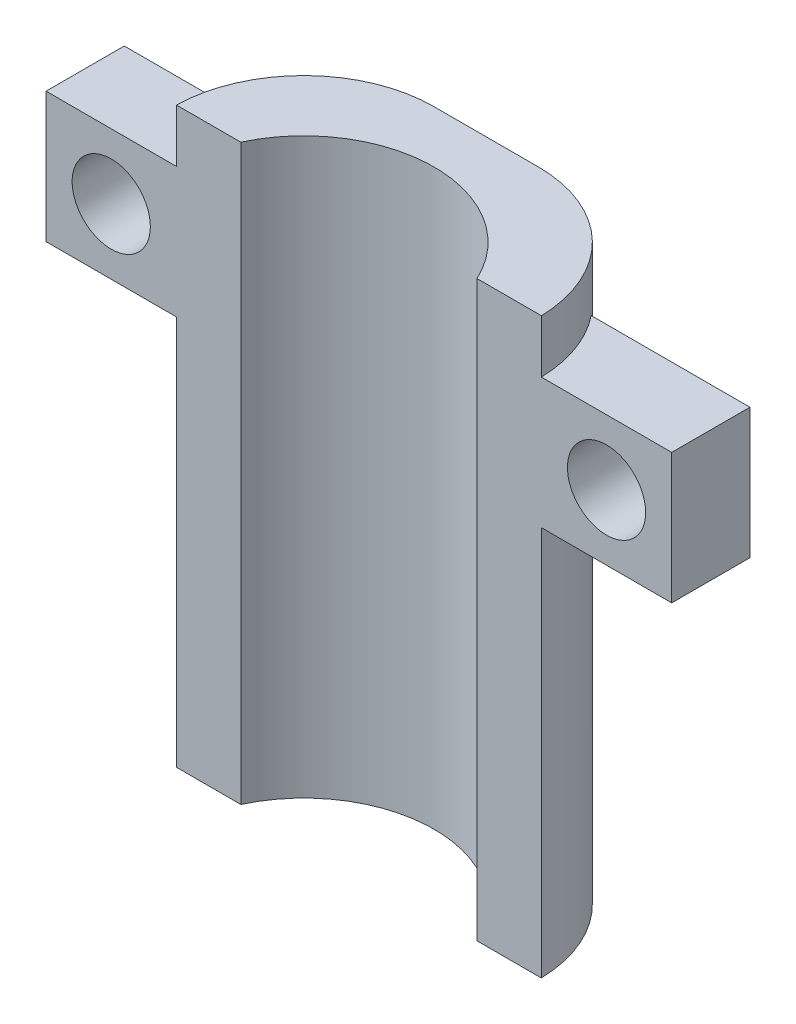
ISO-10303-21;
HEADER;
FILE_DESCRIPTION(('STEP AP214'),'2;1');
FILE_NAME('part.step','',(''),(''),'','','');
FILE_SCHEMA(('AUTOMOTIVE_DESIGN { 1 0 10303 214 1 1 1 1 }'));
ENDSEC;
DATA;
#1=APPLICATION_CONTEXT('core data for automotive mechanical design processes');
#2=APPLICATION_PROTOCOL_DEFINITION('international standard','automotive_design',2000,#1);
#3=PRODUCT_CONTEXT('',#1,'mechanical');
#4=PRODUCT('Part','Part','',(#3));
#5=PRODUCT_RELATED_PRODUCT_CATEGORY('part','',(#4));
#6=PRODUCT_DEFINITION_FORMATION('','',#4);
#7=PRODUCT_DEFINITION_CONTEXT('part definition',#1,'design');
#8=PRODUCT_DEFINITION('design','',#6,#7);
#9=PRODUCT_DEFINITION_SHAPE('','',#8);
#10=(LENGTH_UNIT() NAMED_UNIT(*) SI_UNIT(.MILLI.,.METRE.));
#11=(NAMED_UNIT(*) PLANE_ANGLE_UNIT() SI_UNIT($,.RADIAN.));
#12=(NAMED_UNIT(*) SI_UNIT($,.STERADIAN.) SOLID_ANGLE_UNIT());
#13=UNCERTAINTY_MEASURE_WITH_UNIT(LENGTH_MEASURE(1.E-05),#10,'distance_accuracy_value','');
#14=(GEOMETRIC_REPRESENTATION_CONTEXT(3) GLOBAL_UNCERTAINTY_ASSIGNED_CONTEXT((#13)) GLOBAL_UNIT_ASSIGNED_CONTEXT((#10,
#11,#12)) REPRESENTATION_CONTEXT('',''));
#15=CARTESIAN_POINT('',(0.,0.,0.));
#16=DIRECTION('',(0.,0.,1.));
#17=DIRECTION('',(1.,0.,0.));
#18=AXIS2_PLACEMENT_3D('',#15,#16,#17);
#19=CARTESIAN_POINT('',(0.,0.,-7.1152257334999));
#20=DIRECTION('',(0.,0.,1.));
#21=DIRECTION('',(1.,0.,0.));
#22=AXIS2_PLACEMENT_3D('',#19,#20,#21);
#23=PLANE('',#22);
#24=DIRECTION('',(0.,-1.,0.));
#25=VECTOR('',#24,1.);
#26=CARTESIAN_POINT('',(-7.16768081222446,20.1672314578582,-7.11522573349974));
#27=LINE('',#26,#25);
#28=CARTESIAN_POINT('',(-7.16768081222446,20.1672314578582,-7.11522573349974));
#29=VERTEX_POINT('',#28);
#30=CARTESIAN_POINT('',(-7.16768081222446,-1.8327685421418,-7.11522573349974));
#31=VERTEX_POINT('',#30);
#32=EDGE_CURVE('E11',#29,#31,#27,.T.);
#33=ORIENTED_EDGE('',*,*,#32,.F.);
#34=DIRECTION('',(-1.,0.,0.));
#35=VECTOR('',#34,1.);
#36=CARTESIAN_POINT('',(-10.6371377877803,20.1672314578582,-7.11522573349974));
#37=LINE('',#36,#35);
#38=CARTESIAN_POINT('',(-9.63580991448947,20.1672314578582,-7.1152257334999));
#39=VERTEX_POINT('',#38);
#40=EDGE_CURVE('E193',#29,#39,#37,.T.);
#41=ORIENTED_EDGE('',*,*,#40,.T.);
#42=DIRECTION('',(0.,-1.,0.));
#43=VECTOR('',#42,1.);
#44=CARTESIAN_POINT('',(-9.63580991448947,0.,-7.1152257334999));
#45=LINE('',#44,#43);
#46=CARTESIAN_POINT('',(-9.63580991448944,18.1272314578582,-7.1152257334999));
#47=VERTEX_POINT('',#46);
#48=EDGE_CURVE('E152',#47,#39,#45,.F.);
#49=ORIENTED_EDGE('',*,*,#48,.F.);
#50=DIRECTION('',(-1.,0.,0.));
#51=VECTOR('',#50,1.);
#52=CARTESIAN_POINT('',(0.,18.1272314578582,-7.11522573349976));
#53=LINE('',#52,#51);
#54=CARTESIAN_POINT('',(-14.6358099144894,18.1272314578582,-7.1152257334996));
#55=VERTEX_POINT('',#54);
#56=EDGE_CURVE('E255',#47,#55,#53,.T.);
#57=ORIENTED_EDGE('',*,*,#56,.T.);
#58=DIRECTION('',(0.,-1.,0.));
#59=VECTOR('',#58,1.);
#60=CARTESIAN_POINT('',(-14.6358099144895,0.,-7.11522573349976));
#61=LINE('',#60,#59);
#62=CARTESIAN_POINT('',(-14.6358099144895,13.1272314578582,-7.1152257334999));
#63=VERTEX_POINT('',#62);
#64=EDGE_CURVE('E252',#55,#63,#61,.T.);
#65=ORIENTED_EDGE('',*,*,#64,.T.);
#66=DIRECTION('',(-1.,0.,0.));
#67=VECTOR('',#66,1.);
#68=CARTESIAN_POINT('',(0.,13.1272314578582,-7.1152257334999));
#69=LINE('',#68,#67);
#70=CARTESIAN_POINT('',(-9.63580991448948,13.1272314578582,-7.11522573349976));
#71=VERTEX_POINT('',#70);
#72=EDGE_CURVE('E248',#71,#63,#69,.T.);
#73=ORIENTED_EDGE('',*,*,#72,.F.);
#74=CARTESIAN_POINT('',(-9.63580991448948,-1.83276854214179,-7.1152257334999));
#75=VERTEX_POINT('',#74);
#76=EDGE_CURVE('E151',#75,#71,#45,.F.);
#77=ORIENTED_EDGE('',*,*,#76,.F.);
#78=DIRECTION('',(1.,0.,0.));
#79=VECTOR('',#78,1.);
#80=CARTESIAN_POINT('',(-15.6371377877803,-1.83276854214179,-7.1152257334999));
#81=LINE('',#80,#79);
#82=EDGE_CURVE('E145',#75,#31,#81,.T.);
#83=ORIENTED_EDGE('',*,*,#82,.T.);
#84=EDGE_LOOP('',(#33,#41,#49,#57,#65,#73,#77,#83));
#85=FACE_BOUND('',#84,.T.);
#86=CARTESIAN_POINT('',(-12.1358099144895,15.6272314578582,-7.1152257334999));
#87=DIRECTION('',(0.,0.,1.));
#88=DIRECTION('',(1.,0.,0.));
#89=AXIS2_PLACEMENT_3D('',#86,#87,#88);
#90=CIRCLE('',#89,1.5);
#91=CARTESIAN_POINT('',(-10.6358099144895,15.6272314578582,-7.1152257334999));
#92=VERTEX_POINT('',#91);
#93=EDGE_CURVE('E194',#92,#92,#90,.T.);
#94=ORIENTED_EDGE('',*,*,#93,.F.);
#95=EDGE_LOOP('',(#94));
#96=FACE_BOUND('',#95,.T.);
#97=ADVANCED_FACE('F36',(#85,#96),#23,.T.);
#98=CARTESIAN_POINT('',(-15.6371377877803,-1.83276854214179,2.));
#99=DIRECTION('',(0.,1.,0.));
#100=DIRECTION('',(0.,0.,1.));
#101=AXIS2_PLACEMENT_3D('',#98,#99,#100);
#102=PLANE('',#101);
#103=CARTESIAN_POINT('',(1.89340523666388,-1.83276854214187,-7.11522573349993));
#104=VERTEX_POINT('',#103);
#105=CARTESIAN_POINT('',(4.36153433892891,-1.83276854214179,-7.1152257334999));
#106=VERTEX_POINT('',#105);
#107=EDGE_CURVE('E148',#104,#106,#81,.T.);
#108=ORIENTED_EDGE('',*,*,#107,.F.);
#109=CARTESIAN_POINT('',(-2.63713778778029,-1.83276854214179,-4.99999999999984));
#110=DIRECTION('',(0.,-1.,0.));
#111=DIRECTION('',(0.,0.,-1.));
#112=AXIS2_PLACEMENT_3D('',#109,#110,#111);
#113=CIRCLE('',#112,5.);
#114=EDGE_CURVE('E50',#31,#104,#113,.T.);
#115=ORIENTED_EDGE('',*,*,#114,.F.);
#116=ORIENTED_EDGE('',*,*,#82,.F.);
#117=CARTESIAN_POINT('',(-4.63713778778028,-1.83276854214179,-6.99999999999984));
#118=DIRECTION('',(0.,1.,0.));
#119=DIRECTION('',(0.,0.,1.));
#120=AXIS2_PLACEMENT_3D('',#117,#118,#119);
#121=CIRCLE('',#120,5.);
#122=CARTESIAN_POINT('',(-4.63713778778028,-1.83276854214187,-11.9999999999998));
#123=VERTEX_POINT('',#122);
#124=EDGE_CURVE('E179',#75,#123,#121,.F.);
#125=ORIENTED_EDGE('',*,*,#124,.T.);
#126=DIRECTION('',(-1.,0.,0.));
#127=VECTOR('',#126,1.);
#128=CARTESIAN_POINT('',(4.36286221221971,-1.83276854214179,-12.));
#129=LINE('',#128,#127);
#130=CARTESIAN_POINT('',(-0.637137787780323,-1.83276854214187,-12.));
#131=VERTEX_POINT('',#130);
#132=EDGE_CURVE('E160',#131,#123,#129,.T.);
#133=ORIENTED_EDGE('',*,*,#132,.F.);
#134=CARTESIAN_POINT('',(-0.637137787780288,-1.83276854214179,-7.00000000000001));
#135=DIRECTION('',(0.,1.,0.));
#136=DIRECTION('',(0.,0.,1.));
#137=AXIS2_PLACEMENT_3D('',#134,#135,#136);
#138=CIRCLE('',#137,5.);
#139=EDGE_CURVE('E177',#131,#106,#138,.F.);
#140=ORIENTED_EDGE('',*,*,#139,.T.);
#141=EDGE_LOOP('',(#108,#115,#116,#125,#133,#140));
#142=FACE_BOUND('',#141,.T.);
#143=ADVANCED_FACE('F144',(#142),#102,.F.);
#144=CARTESIAN_POINT('',(-10.6371377877803,20.1672314578582,2.00000000000017));
#145=DIRECTION('',(0.,-1.,0.));
#146=DIRECTION('',(0.,0.,-1.));
#147=AXIS2_PLACEMENT_3D('',#144,#145,#146);
#148=PLANE('',#147);
#149=ORIENTED_EDGE('',*,*,#40,.F.);
#150=CARTESIAN_POINT('',(-2.63713778778029,20.1672314578582,-4.99999999999984));
#151=DIRECTION('',(0.,-1.,0.));
#152=DIRECTION('',(0.,0.,-1.));
#153=AXIS2_PLACEMENT_3D('',#150,#151,#152);
#154=CIRCLE('',#153,5.);
#155=CARTESIAN_POINT('',(1.89340523666389,20.1672314578581,-7.11522573349993));
#156=VERTEX_POINT('',#155);
#157=EDGE_CURVE('E137',#29,#156,#154,.T.);
#158=ORIENTED_EDGE('',*,*,#157,.T.);
#159=CARTESIAN_POINT('',(4.36153433892891,20.1672314578582,-7.11522573349974));
#160=VERTEX_POINT('',#159);
#161=EDGE_CURVE('E156',#160,#156,#37,.T.);
#162=ORIENTED_EDGE('',*,*,#161,.F.);
#163=CARTESIAN_POINT('',(-0.637137787780281,20.1672314578582,-7.00000000000001));
#164=DIRECTION('',(0.,-1.,0.));
#165=DIRECTION('',(0.,0.,-1.));
#166=AXIS2_PLACEMENT_3D('',#163,#164,#165);
#167=CIRCLE('',#166,5.);
#168=CARTESIAN_POINT('',(-0.637137787780288,20.1672314578582,-12.));
#169=VERTEX_POINT('',#168);
#170=EDGE_CURVE('E172',#160,#169,#167,.F.);
#171=ORIENTED_EDGE('',*,*,#170,.T.);
#172=DIRECTION('',(1.,0.,0.));
#173=VECTOR('',#172,1.);
#174=CARTESIAN_POINT('',(4.36286221221972,20.1672314578582,-11.9999999999998));
#175=LINE('',#174,#173);
#176=CARTESIAN_POINT('',(-4.63713778778028,20.1672314578582,-11.9999999999998));
#177=VERTEX_POINT('',#176);
#178=EDGE_CURVE('E163',#177,#169,#175,.T.);
#179=ORIENTED_EDGE('',*,*,#178,.F.);
#180=CARTESIAN_POINT('',(-4.63713778778027,20.1672314578582,-6.99999999999984));
#181=DIRECTION('',(0.,-1.,0.));
#182=DIRECTION('',(0.,0.,-1.));
#183=AXIS2_PLACEMENT_3D('',#180,#181,#182);
#184=CIRCLE('',#183,5.);
#185=EDGE_CURVE('E174',#177,#39,#184,.F.);
#186=ORIENTED_EDGE('',*,*,#185,.T.);
#187=EDGE_LOOP('',(#149,#158,#162,#171,#179,#186));
#188=FACE_BOUND('',#187,.T.);
#189=ADVANCED_FACE('F191',(#188),#148,.F.);
#190=CARTESIAN_POINT('',(-4.63713778778028,0.,-6.99999999999984));
#191=DIRECTION('',(0.,-1.,0.));
#192=DIRECTION('',(1.,0.,0.));
#193=AXIS2_PLACEMENT_3D('',#190,#191,#192);
#194=CYLINDRICAL_SURFACE('',#193,5.);
#195=CARTESIAN_POINT('',(-4.63713778778024,18.1272314578582,-7.00000000000001));
#196=DIRECTION('',(0.,1.,0.));
#197=DIRECTION('',(0.,0.,1.));
#198=AXIS2_PLACEMENT_3D('',#195,#196,#197);
#199=CIRCLE('',#198,5.);
#200=CARTESIAN_POINT('',(-8.54806716956921,18.1272314578582,-10.1152257334997));
#201=VERTEX_POINT('',#200);
#202=EDGE_CURVE('E200',#47,#201,#199,.F.);
#203=ORIENTED_EDGE('',*,*,#202,.F.);
#204=ORIENTED_EDGE('',*,*,#48,.T.);
#205=ORIENTED_EDGE('',*,*,#185,.F.);
#206=DIRECTION('',(0.,1.,0.));
#207=VECTOR('',#206,1.);
#208=CARTESIAN_POINT('',(-4.63713778778028,20.1672314578582,-11.9999999999998));
#209=LINE('',#208,#207);
#210=EDGE_CURVE('E169',#123,#177,#209,.T.);
#211=ORIENTED_EDGE('',*,*,#210,.F.);
#212=ORIENTED_EDGE('',*,*,#124,.F.);
#213=ORIENTED_EDGE('',*,*,#76,.T.);
#214=CARTESIAN_POINT('',(-4.63713778778028,13.1272314578582,-6.99999999999984));
#215=DIRECTION('',(0.,-1.,0.));
#216=DIRECTION('',(0.,0.,-1.));
#217=AXIS2_PLACEMENT_3D('',#214,#215,#216);
#218=CIRCLE('',#217,5.);
#219=CARTESIAN_POINT('',(-8.54806716956922,13.1272314578582,-10.1152257334996));
#220=VERTEX_POINT('',#219);
#221=EDGE_CURVE('E58',#220,#71,#218,.F.);
#222=ORIENTED_EDGE('',*,*,#221,.F.);
#223=DIRECTION('',(0.,-1.,0.));
#224=VECTOR('',#223,1.);
#225=CARTESIAN_POINT('',(-8.54806716956921,0.,-10.1152257334999));
#226=LINE('',#225,#224);
#227=EDGE_CURVE('E198',#201,#220,#226,.T.);
#228=ORIENTED_EDGE('',*,*,#227,.F.);
#229=EDGE_LOOP('',(#203,#204,#205,#211,#212,#213,#222,#228));
#230=FACE_BOUND('',#229,.T.);
#231=ADVANCED_FACE('F296',(#230),#194,.T.);
#232=CARTESIAN_POINT('',(-0.637137787780281,0.,-7.00000000000001));
#233=DIRECTION('',(0.,1.,0.));
#234=DIRECTION('',(-1.,0.,0.));
#235=AXIS2_PLACEMENT_3D('',#232,#233,#234);
#236=CYLINDRICAL_SURFACE('',#235,5.);
#237=CARTESIAN_POINT('',(-0.637137787780247,18.1272314578582,-6.99999999999984));
#238=DIRECTION('',(0.,1.,0.));
#239=DIRECTION('',(0.,0.,1.));
#240=AXIS2_PLACEMENT_3D('',#237,#238,#239);
#241=CIRCLE('',#240,5.);
#242=CARTESIAN_POINT('',(3.27379159400865,18.1272314578581,-10.1152257334999));
#243=VERTEX_POINT('',#242);
#244=CARTESIAN_POINT('',(4.36153433892892,18.1272314578582,-7.1152257334999));
#245=VERTEX_POINT('',#244);
#246=EDGE_CURVE('E205',#243,#245,#241,.F.);
#247=ORIENTED_EDGE('',*,*,#246,.F.);
#248=DIRECTION('',(0.,1.,0.));
#249=VECTOR('',#248,1.);
#250=CARTESIAN_POINT('',(3.27379159400864,0.,-10.1152257334998));
#251=LINE('',#250,#249);
#252=CARTESIAN_POINT('',(3.27379159400864,13.1272314578582,-10.1152257334997));
#253=VERTEX_POINT('',#252);
#254=EDGE_CURVE('E185',#253,#243,#251,.T.);
#255=ORIENTED_EDGE('',*,*,#254,.F.);
#256=CARTESIAN_POINT('',(-0.637137787780288,13.1272314578582,-6.99999999999967));
#257=DIRECTION('',(0.,-1.,0.));
#258=DIRECTION('',(0.,0.,-1.));
#259=AXIS2_PLACEMENT_3D('',#256,#257,#258);
#260=CIRCLE('',#259,5.);
#261=CARTESIAN_POINT('',(4.36153433892891,13.1272314578582,-7.1152257334999));
#262=VERTEX_POINT('',#261);
#263=EDGE_CURVE('E211',#262,#253,#260,.F.);
#264=ORIENTED_EDGE('',*,*,#263,.F.);
#265=DIRECTION('',(0.,1.,0.));
#266=VECTOR('',#265,1.);
#267=CARTESIAN_POINT('',(4.36153433892891,0.,-7.1152257334999));
#268=LINE('',#267,#266);
#269=EDGE_CURVE('E181',#262,#106,#268,.F.);
#270=ORIENTED_EDGE('',*,*,#269,.T.);
#271=ORIENTED_EDGE('',*,*,#139,.F.);
#272=DIRECTION('',(0.,-1.,0.));
#273=VECTOR('',#272,1.);
#274=CARTESIAN_POINT('',(-0.63713778778033,-1.83276854214186,-12.));
#275=LINE('',#274,#273);
#276=EDGE_CURVE('E166',#169,#131,#275,.T.);
#277=ORIENTED_EDGE('',*,*,#276,.F.);
#278=ORIENTED_EDGE('',*,*,#170,.F.);
#279=EDGE_CURVE('E182',#160,#245,#268,.F.);
#280=ORIENTED_EDGE('',*,*,#279,.T.);
#281=EDGE_LOOP('',(#247,#255,#264,#270,#271,#277,#278,#280));
#282=FACE_BOUND('',#281,.T.);
#283=ADVANCED_FACE('F38',(#282),#236,.T.);
#284=CARTESIAN_POINT('',(0.,0.,-12.));
#285=DIRECTION('',(0.,0.,-1.));
#286=DIRECTION('',(-1.,0.,0.));
#287=AXIS2_PLACEMENT_3D('',#284,#285,#286);
#288=PLANE('',#287);
#289=ORIENTED_EDGE('',*,*,#132,.T.);
#290=ORIENTED_EDGE('',*,*,#210,.T.);
#291=ORIENTED_EDGE('',*,*,#178,.T.);
#292=ORIENTED_EDGE('',*,*,#276,.T.);
#293=EDGE_LOOP('',(#289,#290,#291,#292));
#294=FACE_BOUND('',#293,.T.);
#295=ADVANCED_FACE('F284',(#294),#288,.T.);
#296=DIRECTION('',(0.,-1.,0.));
#297=VECTOR('',#296,1.);
#298=CARTESIAN_POINT('',(1.89340523666389,20.1672314578581,-7.11522573349993));
#299=LINE('',#298,#297);
#300=EDGE_CURVE('E44',#104,#156,#299,.F.);
#301=ORIENTED_EDGE('',*,*,#300,.F.);
#302=ORIENTED_EDGE('',*,*,#107,.T.);
#303=ORIENTED_EDGE('',*,*,#269,.F.);
#304=DIRECTION('',(1.,0.,0.));
#305=VECTOR('',#304,1.);
#306=CARTESIAN_POINT('',(0.,13.1272314578582,-7.1152257334999));
#307=LINE('',#306,#305);
#308=CARTESIAN_POINT('',(9.3615343389289,13.1272314578582,-7.1152257334999));
#309=VERTEX_POINT('',#308);
#310=EDGE_CURVE('E227',#262,#309,#307,.T.);
#311=ORIENTED_EDGE('',*,*,#310,.T.);
#312=DIRECTION('',(0.,-1.,0.));
#313=VECTOR('',#312,1.);
#314=CARTESIAN_POINT('',(9.36153433892891,0.,-7.11522573349976));
#315=LINE('',#314,#313);
#316=CARTESIAN_POINT('',(9.36153433892894,18.1272314578582,-7.11522573349974));
#317=VERTEX_POINT('',#316);
#318=EDGE_CURVE('E233',#317,#309,#315,.T.);
#319=ORIENTED_EDGE('',*,*,#318,.F.);
#320=DIRECTION('',(1.,0.,0.));
#321=VECTOR('',#320,1.);
#322=CARTESIAN_POINT('',(0.,18.1272314578582,-7.11522573349976));
#323=LINE('',#322,#321);
#324=EDGE_CURVE('E231',#245,#317,#323,.T.);
#325=ORIENTED_EDGE('',*,*,#324,.F.);
#326=ORIENTED_EDGE('',*,*,#279,.F.);
#327=ORIENTED_EDGE('',*,*,#161,.T.);
#328=EDGE_LOOP('',(#301,#302,#303,#311,#319,#325,#326,#327));
#329=FACE_BOUND('',#328,.T.);
#330=CARTESIAN_POINT('',(6.8615343389289,15.6272314578582,-7.11522573349976));
#331=DIRECTION('',(0.,0.,1.));
#332=DIRECTION('',(1.,0.,0.));
#333=AXIS2_PLACEMENT_3D('',#330,#331,#332);
#334=CIRCLE('',#333,1.5);
#335=CARTESIAN_POINT('',(8.3615343389289,15.6272314578582,-7.11522573349976));
#336=VERTEX_POINT('',#335);
#337=EDGE_CURVE('E236',#336,#336,#334,.T.);
#338=ORIENTED_EDGE('',*,*,#337,.F.);
#339=EDGE_LOOP('',(#338));
#340=FACE_BOUND('',#339,.T.);
#341=ADVANCED_FACE('F196',(#329,#340),#23,.T.);
#342=CARTESIAN_POINT('',(4.36153433892891,13.1272314578582,-7.1152257334999));
#343=DIRECTION('',(0.,-1.,0.));
#344=DIRECTION('',(0.,0.,-1.));
#345=AXIS2_PLACEMENT_3D('',#342,#343,#344);
#346=PLANE('',#345);
#347=DIRECTION('',(-1.,0.,0.));
#348=VECTOR('',#347,1.);
#349=CARTESIAN_POINT('',(4.36153433892891,13.1272314578582,-10.1152257334999));
#350=LINE('',#349,#348);
#351=CARTESIAN_POINT('',(-14.6358099144895,13.1272314578582,-10.1152257334999));
#352=VERTEX_POINT('',#351);
#353=EDGE_CURVE('E220',#220,#352,#350,.T.);
#354=ORIENTED_EDGE('',*,*,#353,.F.);
#355=ORIENTED_EDGE('',*,*,#221,.T.);
#356=ORIENTED_EDGE('',*,*,#72,.T.);
#357=DIRECTION('',(0.,0.,1.));
#358=VECTOR('',#357,1.);
#359=CARTESIAN_POINT('',(-14.6358099144895,13.1272314578582,-10.1152257334999));
#360=LINE('',#359,#358);
#361=EDGE_CURVE('E239',#352,#63,#360,.T.);
#362=ORIENTED_EDGE('',*,*,#361,.F.);
#363=EDGE_LOOP('',(#354,#355,#356,#362));
#364=FACE_BOUND('',#363,.T.);
#365=ADVANCED_FACE('F283',(#364),#346,.T.);
#366=CARTESIAN_POINT('',(4.36153433892892,18.1272314578582,-7.1152257334999));
#367=DIRECTION('',(0.,1.,0.));
#368=DIRECTION('',(0.,0.,1.));
#369=AXIS2_PLACEMENT_3D('',#366,#367,#368);
#370=PLANE('',#369);
#371=DIRECTION('',(1.,0.,0.));
#372=VECTOR('',#371,1.);
#373=CARTESIAN_POINT('',(4.36153433892891,18.1272314578582,-10.1152257334999));
#374=LINE('',#373,#372);
#375=CARTESIAN_POINT('',(-14.6358099144895,18.1272314578582,-10.1152257334996));
#376=VERTEX_POINT('',#375);
#377=EDGE_CURVE('E214',#376,#201,#374,.T.);
#378=ORIENTED_EDGE('',*,*,#377,.F.);
#379=DIRECTION('',(0.,0.,1.));
#380=VECTOR('',#379,1.);
#381=CARTESIAN_POINT('',(-14.6358099144895,18.1272314578582,-10.1152257334996));
#382=LINE('',#381,#380);
#383=EDGE_CURVE('E244',#376,#55,#382,.T.);
#384=ORIENTED_EDGE('',*,*,#383,.T.);
#385=ORIENTED_EDGE('',*,*,#56,.F.);
#386=ORIENTED_EDGE('',*,*,#202,.T.);
#387=EDGE_LOOP('',(#378,#384,#385,#386));
#388=FACE_BOUND('',#387,.T.);
#389=ADVANCED_FACE('F289',(#388),#370,.T.);
#390=CARTESIAN_POINT('',(0.,0.,-10.1152257334999));
#391=DIRECTION('',(0.,0.,-1.));
#392=DIRECTION('',(-1.,0.,0.));
#393=AXIS2_PLACEMENT_3D('',#390,#391,#392);
#394=PLANE('',#393);
#395=ORIENTED_EDGE('',*,*,#377,.T.);
#396=ORIENTED_EDGE('',*,*,#227,.T.);
#397=ORIENTED_EDGE('',*,*,#353,.T.);
#398=DIRECTION('',(0.,-1.,0.));
#399=VECTOR('',#398,1.);
#400=CARTESIAN_POINT('',(-14.6358099144895,0.,-10.1152257334997));
#401=LINE('',#400,#399);
#402=EDGE_CURVE('E246',#376,#352,#401,.T.);
#403=ORIENTED_EDGE('',*,*,#402,.F.);
#404=EDGE_LOOP('',(#395,#396,#397,#403));
#405=FACE_BOUND('',#404,.T.);
#406=CARTESIAN_POINT('',(-12.1358099144895,15.6272314578582,-10.1152257334999));
#407=DIRECTION('',(0.,0.,1.));
#408=DIRECTION('',(1.,0.,0.));
#409=AXIS2_PLACEMENT_3D('',#406,#407,#408);
#410=CIRCLE('',#409,1.5);
#411=CARTESIAN_POINT('',(-10.6358099144895,15.6272314578582,-10.1152257334999));
#412=VERTEX_POINT('',#411);
#413=EDGE_CURVE('E251',#412,#412,#410,.T.);
#414=ORIENTED_EDGE('',*,*,#413,.T.);
#415=EDGE_LOOP('',(#414));
#416=FACE_BOUND('',#415,.T.);
#417=ADVANCED_FACE('F265',(#405,#416),#394,.T.);
#418=CARTESIAN_POINT('',(9.36153433892891,18.1272314578582,-10.1152257334999));
#419=VERTEX_POINT('',#418);
#420=EDGE_CURVE('E216',#243,#419,#374,.T.);
#421=ORIENTED_EDGE('',*,*,#420,.F.);
#422=ORIENTED_EDGE('',*,*,#246,.T.);
#423=ORIENTED_EDGE('',*,*,#324,.T.);
#424=DIRECTION('',(0.,0.,1.));
#425=VECTOR('',#424,1.);
#426=CARTESIAN_POINT('',(9.36153433892891,18.1272314578582,-10.1152257334999));
#427=LINE('',#426,#425);
#428=EDGE_CURVE('E221',#419,#317,#427,.T.);
#429=ORIENTED_EDGE('',*,*,#428,.F.);
#430=EDGE_LOOP('',(#421,#422,#423,#429));
#431=FACE_BOUND('',#430,.T.);
#432=ADVANCED_FACE('F326',(#431),#370,.T.);
#433=CARTESIAN_POINT('',(9.3615343389289,13.1272314578582,-10.1152257334999));
#434=VERTEX_POINT('',#433);
#435=EDGE_CURVE('E217',#434,#253,#350,.T.);
#436=ORIENTED_EDGE('',*,*,#435,.F.);
#437=DIRECTION('',(0.,0.,1.));
#438=VECTOR('',#437,1.);
#439=CARTESIAN_POINT('',(9.3615343389289,13.1272314578582,-10.1152257334999));
#440=LINE('',#439,#438);
#441=EDGE_CURVE('E224',#434,#309,#440,.T.);
#442=ORIENTED_EDGE('',*,*,#441,.T.);
#443=ORIENTED_EDGE('',*,*,#310,.F.);
#444=ORIENTED_EDGE('',*,*,#263,.T.);
#445=EDGE_LOOP('',(#436,#442,#443,#444));
#446=FACE_BOUND('',#445,.T.);
#447=ADVANCED_FACE('F291',(#446),#346,.T.);
#448=ORIENTED_EDGE('',*,*,#435,.T.);
#449=ORIENTED_EDGE('',*,*,#254,.T.);
#450=ORIENTED_EDGE('',*,*,#420,.T.);
#451=DIRECTION('',(0.,-1.,0.));
#452=VECTOR('',#451,1.);
#453=CARTESIAN_POINT('',(9.3615343389289,0.,-10.1152257334997));
#454=LINE('',#453,#452);
#455=EDGE_CURVE('E225',#419,#434,#454,.T.);
#456=ORIENTED_EDGE('',*,*,#455,.T.);
#457=EDGE_LOOP('',(#448,#449,#450,#456));
#458=FACE_BOUND('',#457,.T.);
#459=CARTESIAN_POINT('',(6.86153433892891,15.6272314578582,-10.1152257334998));
#460=DIRECTION('',(0.,0.,1.));
#461=DIRECTION('',(1.,0.,0.));
#462=AXIS2_PLACEMENT_3D('',#459,#460,#461);
#463=CIRCLE('',#462,1.5);
#464=CARTESIAN_POINT('',(8.36153433892891,15.6272314578582,-10.1152257334998));
#465=VERTEX_POINT('',#464);
#466=EDGE_CURVE('E230',#465,#465,#463,.T.);
#467=ORIENTED_EDGE('',*,*,#466,.T.);
#468=EDGE_LOOP('',(#467));
#469=FACE_BOUND('',#468,.T.);
#470=ADVANCED_FACE('F328',(#458,#469),#394,.T.);
#471=CARTESIAN_POINT('',(9.3615343389289,0.,-10.1152257334997));
#472=DIRECTION('',(-1.,0.,0.));
#473=DIRECTION('',(0.,0.,1.));
#474=AXIS2_PLACEMENT_3D('',#471,#472,#473);
#475=PLANE('',#474);
#476=ORIENTED_EDGE('',*,*,#318,.T.);
#477=ORIENTED_EDGE('',*,*,#441,.F.);
#478=ORIENTED_EDGE('',*,*,#455,.F.);
#479=ORIENTED_EDGE('',*,*,#428,.T.);
#480=EDGE_LOOP('',(#476,#477,#478,#479));
#481=FACE_BOUND('',#480,.T.);
#482=ADVANCED_FACE('F322',(#481),#475,.F.);
#483=CARTESIAN_POINT('',(6.86153433892891,15.6272314578582,-10.1152257334998));
#484=DIRECTION('',(0.,0.,1.));
#485=DIRECTION('',(1.,0.,0.));
#486=AXIS2_PLACEMENT_3D('',#483,#484,#485);
#487=CYLINDRICAL_SURFACE('',#486,1.5);
#488=ORIENTED_EDGE('',*,*,#466,.F.);
#489=EDGE_LOOP('',(#488));
#490=FACE_BOUND('',#489,.T.);
#491=ORIENTED_EDGE('',*,*,#337,.T.);
#492=EDGE_LOOP('',(#491));
#493=FACE_BOUND('',#492,.T.);
#494=ADVANCED_FACE('F271',(#490,#493),#487,.F.);
#495=CARTESIAN_POINT('',(-12.1358099144895,15.6272314578582,-10.1152257334999));
#496=DIRECTION('',(0.,0.,1.));
#497=DIRECTION('',(1.,0.,0.));
#498=AXIS2_PLACEMENT_3D('',#495,#496,#497);
#499=CYLINDRICAL_SURFACE('',#498,1.5);
#500=ORIENTED_EDGE('',*,*,#413,.F.);
#501=EDGE_LOOP('',(#500));
#502=FACE_BOUND('',#501,.T.);
#503=ORIENTED_EDGE('',*,*,#93,.T.);
#504=EDGE_LOOP('',(#503));
#505=FACE_BOUND('',#504,.T.);
#506=ADVANCED_FACE('F267',(#502,#505),#499,.F.);
#507=CARTESIAN_POINT('',(-14.6358099144895,0.,-10.1152257334997));
#508=DIRECTION('',(-1.,0.,0.));
#509=DIRECTION('',(0.,0.,1.));
#510=AXIS2_PLACEMENT_3D('',#507,#508,#509);
#511=PLANE('',#510);
#512=ORIENTED_EDGE('',*,*,#64,.F.);
#513=ORIENTED_EDGE('',*,*,#383,.F.);
#514=ORIENTED_EDGE('',*,*,#402,.T.);
#515=ORIENTED_EDGE('',*,*,#361,.T.);
#516=EDGE_LOOP('',(#512,#513,#514,#515));
#517=FACE_BOUND('',#516,.T.);
#518=ADVANCED_FACE('F270',(#517),#511,.T.);
#519=CARTESIAN_POINT('',(-2.63713778778029,20.1672314578582,-4.99999999999984));
#520=DIRECTION('',(0.,-1.,0.));
#521=DIRECTION('',(0.,0.,-1.));
#522=AXIS2_PLACEMENT_3D('',#519,#520,#521);
#523=CYLINDRICAL_SURFACE('',#522,5.);
#524=ORIENTED_EDGE('',*,*,#32,.T.);
#525=ORIENTED_EDGE('',*,*,#114,.T.);
#526=ORIENTED_EDGE('',*,*,#300,.T.);
#527=ORIENTED_EDGE('',*,*,#157,.F.);
#528=EDGE_LOOP('',(#524,#525,#526,#527));
#529=FACE_BOUND('',#528,.T.);
#530=ADVANCED_FACE('F135',(#529),#523,.F.);
#531=CLOSED_SHELL('',(#97,#143,#189,#231,#283,#295,#341,#365,#389,#417,#432,#447,#470,#482,#494,
#506,#518,#530));
#532=MANIFOLD_SOLID_BREP('B2',#531);
#533=ADVANCED_BREP_SHAPE_REPRESENTATION('',(#18,#532),#14);
#534=SHAPE_DEFINITION_REPRESENTATION(#9,#533);
ENDSEC;
END-ISO-10303-21;
